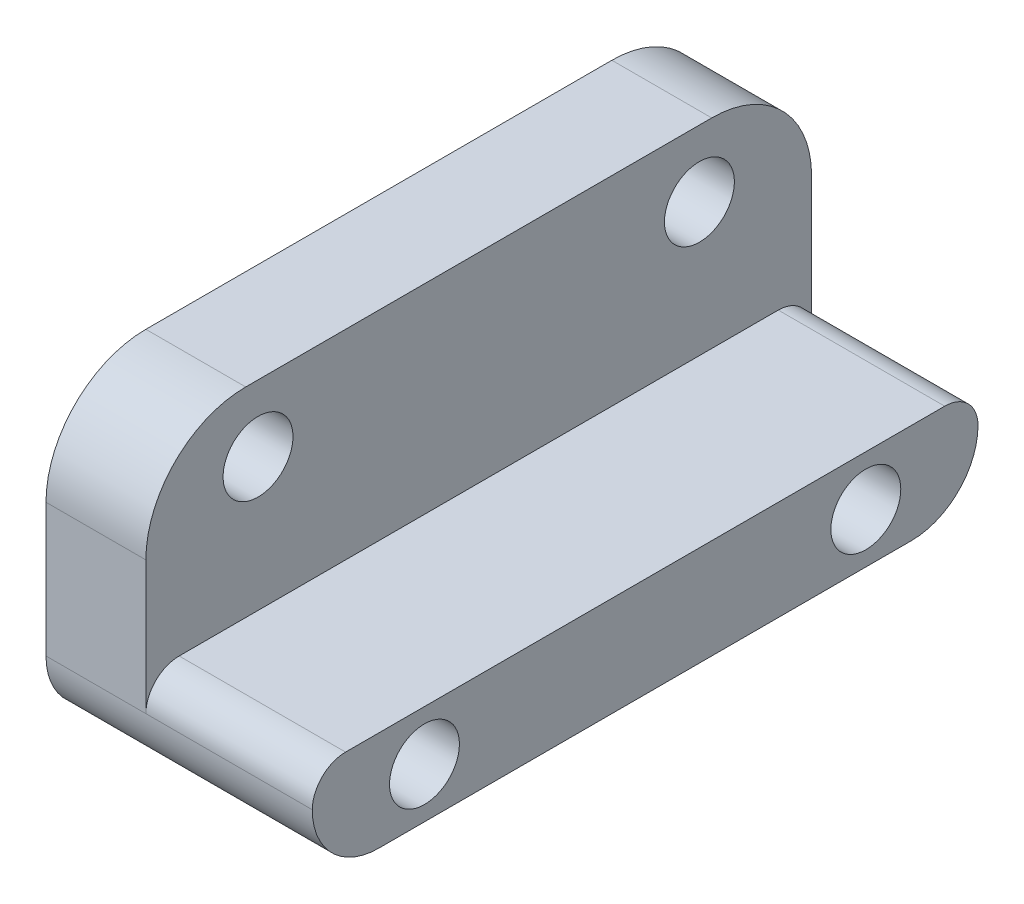
ISO-10303-21;
HEADER;
FILE_DESCRIPTION(('STEP AP214'),'2;1');
FILE_NAME('part.step','',(''),(''),'','','');
FILE_SCHEMA(('AUTOMOTIVE_DESIGN { 1 0 10303 214 1 1 1 1 }'));
ENDSEC;
DATA;
#1=APPLICATION_CONTEXT('core data for automotive mechanical design processes');
#2=APPLICATION_PROTOCOL_DEFINITION('international standard','automotive_design',2000,#1);
#3=PRODUCT_CONTEXT('',#1,'mechanical');
#4=PRODUCT('Part','Part','',(#3));
#5=PRODUCT_RELATED_PRODUCT_CATEGORY('part','',(#4));
#6=PRODUCT_DEFINITION_FORMATION('','',#4);
#7=PRODUCT_DEFINITION_CONTEXT('part definition',#1,'design');
#8=PRODUCT_DEFINITION('design','',#6,#7);
#9=PRODUCT_DEFINITION_SHAPE('','',#8);
#10=(LENGTH_UNIT() NAMED_UNIT(*) SI_UNIT(.MILLI.,.METRE.));
#11=(NAMED_UNIT(*) PLANE_ANGLE_UNIT() SI_UNIT($,.RADIAN.));
#12=(NAMED_UNIT(*) SI_UNIT($,.STERADIAN.) SOLID_ANGLE_UNIT());
#13=UNCERTAINTY_MEASURE_WITH_UNIT(LENGTH_MEASURE(1.E-05),#10,'distance_accuracy_value','');
#14=(GEOMETRIC_REPRESENTATION_CONTEXT(3) GLOBAL_UNCERTAINTY_ASSIGNED_CONTEXT((#13)) GLOBAL_UNIT_ASSIGNED_CONTEXT((#10,
#11,#12)) REPRESENTATION_CONTEXT('',''));
#15=CARTESIAN_POINT('',(0.,0.,0.));
#16=DIRECTION('',(0.,0.,1.));
#17=DIRECTION('',(1.,0.,0.));
#18=AXIS2_PLACEMENT_3D('',#15,#16,#17);
#19=CARTESIAN_POINT('',(8.,-7.,-19.));
#20=DIRECTION('',(-1.,0.,0.));
#21=DIRECTION('',(0.,0.,1.));
#22=AXIS2_PLACEMENT_3D('',#19,#20,#21);
#23=CYLINDRICAL_SURFACE('',#22,1.);
#24=DIRECTION('',(-1.,0.,0.));
#25=VECTOR('',#24,1.);
#26=CARTESIAN_POINT('',(8.,-6.,-19.));
#27=LINE('',#26,#25);
#28=CARTESIAN_POINT('',(8.,-6.,-19.));
#29=VERTEX_POINT('',#28);
#30=CARTESIAN_POINT('',(3.,-6.,-19.));
#31=VERTEX_POINT('',#30);
#32=EDGE_CURVE('E196',#29,#31,#27,.T.);
#33=ORIENTED_EDGE('',*,*,#32,.F.);
#34=CARTESIAN_POINT('',(8.,-7.,-19.));
#35=DIRECTION('',(-1.,0.,0.));
#36=DIRECTION('',(0.,0.,1.));
#37=AXIS2_PLACEMENT_3D('',#34,#35,#36);
#38=CIRCLE('',#37,1.);
#39=CARTESIAN_POINT('',(8.,-7.,-20.));
#40=VERTEX_POINT('',#39);
#41=EDGE_CURVE('E48',#40,#29,#38,.F.);
#42=ORIENTED_EDGE('',*,*,#41,.F.);
#43=DIRECTION('',(-1.,0.,0.));
#44=VECTOR('',#43,1.);
#45=CARTESIAN_POINT('',(3.,-7.,-20.));
#46=LINE('',#45,#44);
#47=CARTESIAN_POINT('',(3.,-7.,-20.));
#48=VERTEX_POINT('',#47);
#49=EDGE_CURVE('E166',#40,#48,#46,.T.);
#50=ORIENTED_EDGE('',*,*,#49,.T.);
#51=CARTESIAN_POINT('',(3.,-7.,-19.));
#52=DIRECTION('',(1.,0.,0.));
#53=DIRECTION('',(0.,0.,-1.));
#54=AXIS2_PLACEMENT_3D('',#51,#52,#53);
#55=CIRCLE('',#54,1.);
#56=EDGE_CURVE('E11',#48,#31,#55,.T.);
#57=ORIENTED_EDGE('',*,*,#56,.T.);
#58=EDGE_LOOP('',(#33,#42,#50,#57));
#59=FACE_BOUND('',#58,.T.);
#60=ADVANCED_FACE('F41',(#59),#23,.T.);
#61=CARTESIAN_POINT('',(8.,-7.,-1.));
#62=DIRECTION('',(1.,0.,0.));
#63=DIRECTION('',(0.,0.,-1.));
#64=AXIS2_PLACEMENT_3D('',#61,#62,#63);
#65=CYLINDRICAL_SURFACE('',#64,1.);
#66=DIRECTION('',(1.,0.,0.));
#67=VECTOR('',#66,1.);
#68=CARTESIAN_POINT('',(8.,-6.,-1.));
#69=LINE('',#68,#67);
#70=CARTESIAN_POINT('',(3.,-6.,-1.));
#71=VERTEX_POINT('',#70);
#72=CARTESIAN_POINT('',(8.,-6.,-1.));
#73=VERTEX_POINT('',#72);
#74=EDGE_CURVE('E188',#71,#73,#69,.T.);
#75=ORIENTED_EDGE('',*,*,#74,.F.);
#76=CARTESIAN_POINT('',(3.,-7.,-1.));
#77=DIRECTION('',(1.,0.,0.));
#78=DIRECTION('',(0.,0.,-1.));
#79=AXIS2_PLACEMENT_3D('',#76,#77,#78);
#80=CIRCLE('',#79,1.);
#81=CARTESIAN_POINT('',(3.,-7.,0.));
#82=VERTEX_POINT('',#81);
#83=EDGE_CURVE('E193',#71,#82,#80,.T.);
#84=ORIENTED_EDGE('',*,*,#83,.T.);
#85=DIRECTION('',(1.,0.,0.));
#86=VECTOR('',#85,1.);
#87=CARTESIAN_POINT('',(3.,-7.,0.));
#88=LINE('',#87,#86);
#89=CARTESIAN_POINT('',(8.,-7.,0.));
#90=VERTEX_POINT('',#89);
#91=EDGE_CURVE('E177',#82,#90,#88,.T.);
#92=ORIENTED_EDGE('',*,*,#91,.T.);
#93=CARTESIAN_POINT('',(8.,-7.,-1.));
#94=DIRECTION('',(-1.,0.,0.));
#95=DIRECTION('',(0.,0.,1.));
#96=AXIS2_PLACEMENT_3D('',#93,#94,#95);
#97=CIRCLE('',#96,1.);
#98=EDGE_CURVE('E191',#73,#90,#97,.F.);
#99=ORIENTED_EDGE('',*,*,#98,.F.);
#100=EDGE_LOOP('',(#75,#84,#92,#99));
#101=FACE_BOUND('',#100,.T.);
#102=ADVANCED_FACE('F254',(#101),#65,.T.);
#103=CARTESIAN_POINT('',(3.,-7.,-2.));
#104=DIRECTION('',(1.,0.,0.));
#105=DIRECTION('',(0.,0.,-1.));
#106=AXIS2_PLACEMENT_3D('',#103,#104,#105);
#107=CYLINDRICAL_SURFACE('',#106,2.);
#108=CARTESIAN_POINT('',(0.,-7.,0.));
#109=VERTEX_POINT('',#108);
#110=EDGE_CURVE('E178',#109,#82,#88,.T.);
#111=ORIENTED_EDGE('',*,*,#110,.F.);
#112=CARTESIAN_POINT('',(0.,-7.,-2.));
#113=DIRECTION('',(1.,0.,0.));
#114=DIRECTION('',(0.,0.,-1.));
#115=AXIS2_PLACEMENT_3D('',#112,#113,#114);
#116=CIRCLE('',#115,2.);
#117=CARTESIAN_POINT('',(0.,-9.,-2.));
#118=VERTEX_POINT('',#117);
#119=EDGE_CURVE('E184',#118,#109,#116,.F.);
#120=ORIENTED_EDGE('',*,*,#119,.F.);
#121=DIRECTION('',(1.,0.,0.));
#122=VECTOR('',#121,1.);
#123=CARTESIAN_POINT('',(3.,-9.,-2.));
#124=LINE('',#123,#122);
#125=CARTESIAN_POINT('',(8.,-9.,-2.));
#126=VERTEX_POINT('',#125);
#127=EDGE_CURVE('E181',#126,#118,#124,.F.);
#128=ORIENTED_EDGE('',*,*,#127,.F.);
#129=CARTESIAN_POINT('',(8.,-7.,-2.));
#130=DIRECTION('',(-1.,0.,0.));
#131=DIRECTION('',(0.,0.,1.));
#132=AXIS2_PLACEMENT_3D('',#129,#130,#131);
#133=CIRCLE('',#132,2.);
#134=EDGE_CURVE('E186',#90,#126,#133,.F.);
#135=ORIENTED_EDGE('',*,*,#134,.F.);
#136=ORIENTED_EDGE('',*,*,#91,.F.);
#137=EDGE_LOOP('',(#111,#120,#128,#135,#136));
#138=FACE_BOUND('',#137,.T.);
#139=ADVANCED_FACE('F248',(#138),#107,.T.);
#140=CARTESIAN_POINT('',(3.,-7.,-18.));
#141=DIRECTION('',(-1.,0.,0.));
#142=DIRECTION('',(0.,0.,1.));
#143=AXIS2_PLACEMENT_3D('',#140,#141,#142);
#144=CYLINDRICAL_SURFACE('',#143,2.);
#145=ORIENTED_EDGE('',*,*,#49,.F.);
#146=CARTESIAN_POINT('',(8.,-7.,-18.));
#147=DIRECTION('',(-1.,0.,0.));
#148=DIRECTION('',(0.,0.,1.));
#149=AXIS2_PLACEMENT_3D('',#146,#147,#148);
#150=CIRCLE('',#149,2.);
#151=CARTESIAN_POINT('',(8.,-9.,-18.));
#152=VERTEX_POINT('',#151);
#153=EDGE_CURVE('E172',#152,#40,#150,.F.);
#154=ORIENTED_EDGE('',*,*,#153,.F.);
#155=DIRECTION('',(-1.,0.,0.));
#156=VECTOR('',#155,1.);
#157=CARTESIAN_POINT('',(3.,-9.,-18.));
#158=LINE('',#157,#156);
#159=CARTESIAN_POINT('',(0.,-9.,-18.));
#160=VERTEX_POINT('',#159);
#161=EDGE_CURVE('E169',#160,#152,#158,.F.);
#162=ORIENTED_EDGE('',*,*,#161,.F.);
#163=CARTESIAN_POINT('',(0.,-7.,-18.));
#164=DIRECTION('',(1.,0.,0.));
#165=DIRECTION('',(0.,0.,-1.));
#166=AXIS2_PLACEMENT_3D('',#163,#164,#165);
#167=CIRCLE('',#166,2.);
#168=CARTESIAN_POINT('',(0.,-7.,-20.));
#169=VERTEX_POINT('',#168);
#170=EDGE_CURVE('E174',#169,#160,#167,.F.);
#171=ORIENTED_EDGE('',*,*,#170,.F.);
#172=EDGE_CURVE('E165',#48,#169,#46,.T.);
#173=ORIENTED_EDGE('',*,*,#172,.F.);
#174=EDGE_LOOP('',(#145,#154,#162,#171,#173));
#175=FACE_BOUND('',#174,.T.);
#176=ADVANCED_FACE('F263',(#175),#144,.T.);
#177=CARTESIAN_POINT('',(3.,-3.,-17.));
#178=DIRECTION('',(-1.,0.,0.));
#179=DIRECTION('',(0.,0.,1.));
#180=AXIS2_PLACEMENT_3D('',#177,#178,#179);
#181=CYLINDRICAL_SURFACE('',#180,3.);
#182=DIRECTION('',(-1.,0.,0.));
#183=VECTOR('',#182,1.);
#184=CARTESIAN_POINT('',(3.,0.,-17.));
#185=LINE('',#184,#183);
#186=CARTESIAN_POINT('',(3.,0.,-17.));
#187=VERTEX_POINT('',#186);
#188=CARTESIAN_POINT('',(0.,0.,-17.));
#189=VERTEX_POINT('',#188);
#190=EDGE_CURVE('E130',#187,#189,#185,.T.);
#191=ORIENTED_EDGE('',*,*,#190,.F.);
#192=CARTESIAN_POINT('',(3.,-3.,-17.));
#193=DIRECTION('',(1.,0.,0.));
#194=DIRECTION('',(0.,0.,-1.));
#195=AXIS2_PLACEMENT_3D('',#192,#193,#194);
#196=CIRCLE('',#195,3.);
#197=CARTESIAN_POINT('',(3.,-3.,-20.));
#198=VERTEX_POINT('',#197);
#199=EDGE_CURVE('E161',#198,#187,#196,.T.);
#200=ORIENTED_EDGE('',*,*,#199,.F.);
#201=DIRECTION('',(-1.,0.,0.));
#202=VECTOR('',#201,1.);
#203=CARTESIAN_POINT('',(3.,-3.,-20.));
#204=LINE('',#203,#202);
#205=CARTESIAN_POINT('',(0.,-3.,-20.));
#206=VERTEX_POINT('',#205);
#207=EDGE_CURVE('E159',#206,#198,#204,.F.);
#208=ORIENTED_EDGE('',*,*,#207,.F.);
#209=CARTESIAN_POINT('',(0.,-3.,-17.));
#210=DIRECTION('',(1.,0.,0.));
#211=DIRECTION('',(0.,0.,-1.));
#212=AXIS2_PLACEMENT_3D('',#209,#210,#211);
#213=CIRCLE('',#212,3.);
#214=EDGE_CURVE('E163',#189,#206,#213,.F.);
#215=ORIENTED_EDGE('',*,*,#214,.F.);
#216=EDGE_LOOP('',(#191,#200,#208,#215));
#217=FACE_BOUND('',#216,.T.);
#218=ADVANCED_FACE('F241',(#217),#181,.T.);
#219=CARTESIAN_POINT('',(3.,-3.,-3.));
#220=DIRECTION('',(1.,0.,0.));
#221=DIRECTION('',(0.,0.,-1.));
#222=AXIS2_PLACEMENT_3D('',#219,#220,#221);
#223=CYLINDRICAL_SURFACE('',#222,3.);
#224=DIRECTION('',(1.,0.,0.));
#225=VECTOR('',#224,1.);
#226=CARTESIAN_POINT('',(3.,0.,-3.));
#227=LINE('',#226,#225);
#228=CARTESIAN_POINT('',(0.,0.,-3.));
#229=VERTEX_POINT('',#228);
#230=CARTESIAN_POINT('',(3.,0.,-3.));
#231=VERTEX_POINT('',#230);
#232=EDGE_CURVE('E128',#229,#231,#227,.T.);
#233=ORIENTED_EDGE('',*,*,#232,.F.);
#234=CARTESIAN_POINT('',(0.,-3.,-3.));
#235=DIRECTION('',(1.,0.,0.));
#236=DIRECTION('',(0.,0.,-1.));
#237=AXIS2_PLACEMENT_3D('',#234,#235,#236);
#238=CIRCLE('',#237,3.);
#239=CARTESIAN_POINT('',(0.,-3.,0.));
#240=VERTEX_POINT('',#239);
#241=EDGE_CURVE('E137',#240,#229,#238,.F.);
#242=ORIENTED_EDGE('',*,*,#241,.F.);
#243=DIRECTION('',(1.,0.,0.));
#244=VECTOR('',#243,1.);
#245=CARTESIAN_POINT('',(3.,-3.,0.));
#246=LINE('',#245,#244);
#247=CARTESIAN_POINT('',(3.,-3.,0.));
#248=VERTEX_POINT('',#247);
#249=EDGE_CURVE('E147',#248,#240,#246,.F.);
#250=ORIENTED_EDGE('',*,*,#249,.F.);
#251=CARTESIAN_POINT('',(3.,-3.,-3.));
#252=DIRECTION('',(1.,0.,0.));
#253=DIRECTION('',(0.,0.,-1.));
#254=AXIS2_PLACEMENT_3D('',#251,#252,#253);
#255=CIRCLE('',#254,3.);
#256=EDGE_CURVE('E146',#231,#248,#255,.T.);
#257=ORIENTED_EDGE('',*,*,#256,.F.);
#258=EDGE_LOOP('',(#233,#242,#250,#257));
#259=FACE_BOUND('',#258,.T.);
#260=ADVANCED_FACE('F150',(#259),#223,.T.);
#261=CARTESIAN_POINT('',(3.,0.,0.));
#262=DIRECTION('',(1.,0.,0.));
#263=DIRECTION('',(0.,0.,-1.));
#264=AXIS2_PLACEMENT_3D('',#261,#262,#263);
#265=PLANE('',#264);
#266=DIRECTION('',(0.,1.,0.));
#267=VECTOR('',#266,1.);
#268=CARTESIAN_POINT('',(3.,0.,-20.));
#269=LINE('',#268,#267);
#270=EDGE_CURVE('E55',#48,#198,#269,.T.);
#271=ORIENTED_EDGE('',*,*,#270,.T.);
#272=ORIENTED_EDGE('',*,*,#199,.T.);
#273=DIRECTION('',(0.,0.,1.));
#274=VECTOR('',#273,1.);
#275=CARTESIAN_POINT('',(3.,0.,0.));
#276=LINE('',#275,#274);
#277=EDGE_CURVE('E151',#187,#231,#276,.T.);
#278=ORIENTED_EDGE('',*,*,#277,.T.);
#279=ORIENTED_EDGE('',*,*,#256,.T.);
#280=DIRECTION('',(0.,-1.,0.));
#281=VECTOR('',#280,1.);
#282=CARTESIAN_POINT('',(3.,0.,0.));
#283=LINE('',#282,#281);
#284=EDGE_CURVE('E133',#248,#82,#283,.T.);
#285=ORIENTED_EDGE('',*,*,#284,.T.);
#286=ORIENTED_EDGE('',*,*,#83,.F.);
#287=DIRECTION('',(0.,0.,1.));
#288=VECTOR('',#287,1.);
#289=CARTESIAN_POINT('',(3.,-6.,0.));
#290=LINE('',#289,#288);
#291=EDGE_CURVE('E202',#31,#71,#290,.T.);
#292=ORIENTED_EDGE('',*,*,#291,.F.);
#293=ORIENTED_EDGE('',*,*,#56,.F.);
#294=EDGE_LOOP('',(#271,#272,#278,#279,#285,#286,#292,#293));
#295=FACE_BOUND('',#294,.T.);
#296=CARTESIAN_POINT('',(3.,-2.,-3.37));
#297=DIRECTION('',(1.,0.,0.));
#298=DIRECTION('',(0.,0.,-1.));
#299=AXIS2_PLACEMENT_3D('',#296,#297,#298);
#300=CIRCLE('',#299,1.05);
#301=CARTESIAN_POINT('',(3.,-2.,-4.42));
#302=VERTEX_POINT('',#301);
#303=EDGE_CURVE('E227',#302,#302,#300,.T.);
#304=ORIENTED_EDGE('',*,*,#303,.F.);
#305=EDGE_LOOP('',(#304));
#306=FACE_BOUND('',#305,.T.);
#307=CARTESIAN_POINT('',(3.,-2.,-16.63));
#308=DIRECTION('',(1.,0.,0.));
#309=DIRECTION('',(0.,0.,1.));
#310=AXIS2_PLACEMENT_3D('',#307,#308,#309);
#311=CIRCLE('',#310,1.05);
#312=CARTESIAN_POINT('',(3.,-2.,-15.58));
#313=VERTEX_POINT('',#312);
#314=EDGE_CURVE('E220',#313,#313,#311,.T.);
#315=ORIENTED_EDGE('',*,*,#314,.F.);
#316=EDGE_LOOP('',(#315));
#317=FACE_BOUND('',#316,.T.);
#318=ADVANCED_FACE('F207',(#295,#306,#317),#265,.T.);
#319=CARTESIAN_POINT('',(0.,0.,0.));
#320=DIRECTION('',(1.,0.,0.));
#321=DIRECTION('',(0.,0.,-1.));
#322=AXIS2_PLACEMENT_3D('',#319,#320,#321);
#323=PLANE('',#322);
#324=CARTESIAN_POINT('',(0.,-7.5,-3.37));
#325=DIRECTION('',(1.,0.,0.));
#326=DIRECTION('',(0.,0.,-1.));
#327=AXIS2_PLACEMENT_3D('',#324,#325,#326);
#328=CIRCLE('',#327,1.05);
#329=CARTESIAN_POINT('',(0.,-7.5,-4.42));
#330=VERTEX_POINT('',#329);
#331=EDGE_CURVE('E212',#330,#330,#328,.T.);
#332=ORIENTED_EDGE('',*,*,#331,.T.);
#333=EDGE_LOOP('',(#332));
#334=FACE_BOUND('',#333,.T.);
#335=CARTESIAN_POINT('',(0.,-7.5,-16.63));
#336=DIRECTION('',(1.,0.,0.));
#337=DIRECTION('',(0.,0.,-1.));
#338=AXIS2_PLACEMENT_3D('',#335,#336,#337);
#339=CIRCLE('',#338,1.05);
#340=CARTESIAN_POINT('',(0.,-7.5,-17.68));
#341=VERTEX_POINT('',#340);
#342=EDGE_CURVE('E216',#341,#341,#339,.T.);
#343=ORIENTED_EDGE('',*,*,#342,.T.);
#344=EDGE_LOOP('',(#343));
#345=FACE_BOUND('',#344,.T.);
#346=DIRECTION('',(0.,0.,-1.));
#347=VECTOR('',#346,1.);
#348=CARTESIAN_POINT('',(0.,-9.,0.));
#349=LINE('',#348,#347);
#350=EDGE_CURVE('E235',#118,#160,#349,.T.);
#351=ORIENTED_EDGE('',*,*,#350,.F.);
#352=ORIENTED_EDGE('',*,*,#119,.T.);
#353=DIRECTION('',(0.,-1.,0.));
#354=VECTOR('',#353,1.);
#355=CARTESIAN_POINT('',(0.,0.,0.));
#356=LINE('',#355,#354);
#357=EDGE_CURVE('E142',#240,#109,#356,.T.);
#358=ORIENTED_EDGE('',*,*,#357,.F.);
#359=ORIENTED_EDGE('',*,*,#241,.T.);
#360=DIRECTION('',(0.,0.,1.));
#361=VECTOR('',#360,1.);
#362=CARTESIAN_POINT('',(0.,0.,0.));
#363=LINE('',#362,#361);
#364=EDGE_CURVE('E123',#189,#229,#363,.T.);
#365=ORIENTED_EDGE('',*,*,#364,.F.);
#366=ORIENTED_EDGE('',*,*,#214,.T.);
#367=DIRECTION('',(0.,1.,0.));
#368=VECTOR('',#367,1.);
#369=CARTESIAN_POINT('',(0.,0.,-20.));
#370=LINE('',#369,#368);
#371=EDGE_CURVE('E134',#169,#206,#370,.T.);
#372=ORIENTED_EDGE('',*,*,#371,.F.);
#373=ORIENTED_EDGE('',*,*,#170,.T.);
#374=EDGE_LOOP('',(#351,#352,#358,#359,#365,#366,#372,#373));
#375=FACE_BOUND('',#374,.T.);
#376=CARTESIAN_POINT('',(0.,-2.,-3.37));
#377=DIRECTION('',(1.,0.,0.));
#378=DIRECTION('',(0.,0.,-1.));
#379=AXIS2_PLACEMENT_3D('',#376,#377,#378);
#380=CIRCLE('',#379,1.05);
#381=CARTESIAN_POINT('',(0.,-2.,-4.42));
#382=VERTEX_POINT('',#381);
#383=EDGE_CURVE('E223',#382,#382,#380,.T.);
#384=ORIENTED_EDGE('',*,*,#383,.T.);
#385=EDGE_LOOP('',(#384));
#386=FACE_BOUND('',#385,.T.);
#387=CARTESIAN_POINT('',(0.,-2.,-16.63));
#388=DIRECTION('',(1.,0.,0.));
#389=DIRECTION('',(0.,0.,1.));
#390=AXIS2_PLACEMENT_3D('',#387,#388,#389);
#391=CIRCLE('',#390,1.05);
#392=CARTESIAN_POINT('',(0.,-2.,-15.58));
#393=VERTEX_POINT('',#392);
#394=EDGE_CURVE('E224',#393,#393,#391,.T.);
#395=ORIENTED_EDGE('',*,*,#394,.T.);
#396=EDGE_LOOP('',(#395));
#397=FACE_BOUND('',#396,.T.);
#398=ADVANCED_FACE('F139',(#334,#345,#375,#386,#397),#323,.F.);
#399=CARTESIAN_POINT('',(3.,0.,0.));
#400=DIRECTION('',(0.,0.,-1.));
#401=DIRECTION('',(0.,1.,0.));
#402=AXIS2_PLACEMENT_3D('',#399,#400,#401);
#403=PLANE('',#402);
#404=ORIENTED_EDGE('',*,*,#110,.T.);
#405=ORIENTED_EDGE('',*,*,#284,.F.);
#406=ORIENTED_EDGE('',*,*,#249,.T.);
#407=ORIENTED_EDGE('',*,*,#357,.T.);
#408=EDGE_LOOP('',(#404,#405,#406,#407));
#409=FACE_BOUND('',#408,.T.);
#410=ADVANCED_FACE('F244',(#409),#403,.F.);
#411=CARTESIAN_POINT('',(3.,-9.,0.));
#412=DIRECTION('',(0.,1.,0.));
#413=DIRECTION('',(0.,0.,1.));
#414=AXIS2_PLACEMENT_3D('',#411,#412,#413);
#415=PLANE('',#414);
#416=DIRECTION('',(0.,0.,-1.));
#417=VECTOR('',#416,1.);
#418=CARTESIAN_POINT('',(8.,-9.,0.));
#419=LINE('',#418,#417);
#420=EDGE_CURVE('E211',#126,#152,#419,.T.);
#421=ORIENTED_EDGE('',*,*,#420,.F.);
#422=ORIENTED_EDGE('',*,*,#127,.T.);
#423=ORIENTED_EDGE('',*,*,#350,.T.);
#424=ORIENTED_EDGE('',*,*,#161,.T.);
#425=EDGE_LOOP('',(#421,#422,#423,#424));
#426=FACE_BOUND('',#425,.T.);
#427=ADVANCED_FACE('F259',(#426),#415,.F.);
#428=CARTESIAN_POINT('',(3.,0.,-20.));
#429=DIRECTION('',(0.,0.,1.));
#430=DIRECTION('',(0.,-1.,0.));
#431=AXIS2_PLACEMENT_3D('',#428,#429,#430);
#432=PLANE('',#431);
#433=ORIENTED_EDGE('',*,*,#270,.F.);
#434=ORIENTED_EDGE('',*,*,#172,.T.);
#435=ORIENTED_EDGE('',*,*,#371,.T.);
#436=ORIENTED_EDGE('',*,*,#207,.T.);
#437=EDGE_LOOP('',(#433,#434,#435,#436));
#438=FACE_BOUND('',#437,.T.);
#439=ADVANCED_FACE('F237',(#438),#432,.F.);
#440=CARTESIAN_POINT('',(3.,0.,0.));
#441=DIRECTION('',(0.,-1.,0.));
#442=DIRECTION('',(0.,0.,-1.));
#443=AXIS2_PLACEMENT_3D('',#440,#441,#442);
#444=PLANE('',#443);
#445=ORIENTED_EDGE('',*,*,#277,.F.);
#446=ORIENTED_EDGE('',*,*,#190,.T.);
#447=ORIENTED_EDGE('',*,*,#364,.T.);
#448=ORIENTED_EDGE('',*,*,#232,.T.);
#449=EDGE_LOOP('',(#445,#446,#447,#448));
#450=FACE_BOUND('',#449,.T.);
#451=ADVANCED_FACE('F126',(#450),#444,.F.);
#452=CARTESIAN_POINT('',(3.,-2.,-3.37));
#453=DIRECTION('',(-1.,0.,0.));
#454=DIRECTION('',(0.,0.,1.));
#455=AXIS2_PLACEMENT_3D('',#452,#453,#454);
#456=CYLINDRICAL_SURFACE('',#455,1.05);
#457=ORIENTED_EDGE('',*,*,#303,.T.);
#458=EDGE_LOOP('',(#457));
#459=FACE_BOUND('',#458,.T.);
#460=ORIENTED_EDGE('',*,*,#383,.F.);
#461=EDGE_LOOP('',(#460));
#462=FACE_BOUND('',#461,.T.);
#463=ADVANCED_FACE('F287',(#459,#462),#456,.F.);
#464=CARTESIAN_POINT('',(3.,-2.,-16.63));
#465=DIRECTION('',(-1.,0.,0.));
#466=DIRECTION('',(0.,0.,1.));
#467=AXIS2_PLACEMENT_3D('',#464,#465,#466);
#468=CYLINDRICAL_SURFACE('',#467,1.05);
#469=ORIENTED_EDGE('',*,*,#314,.T.);
#470=EDGE_LOOP('',(#469));
#471=FACE_BOUND('',#470,.T.);
#472=ORIENTED_EDGE('',*,*,#394,.F.);
#473=EDGE_LOOP('',(#472));
#474=FACE_BOUND('',#473,.T.);
#475=ADVANCED_FACE('F295',(#471,#474),#468,.F.);
#476=CARTESIAN_POINT('',(8.,-6.,0.));
#477=DIRECTION('',(0.,-1.,0.));
#478=DIRECTION('',(0.,0.,-1.));
#479=AXIS2_PLACEMENT_3D('',#476,#477,#478);
#480=PLANE('',#479);
#481=DIRECTION('',(0.,0.,1.));
#482=VECTOR('',#481,1.);
#483=CARTESIAN_POINT('',(8.,-6.,0.));
#484=LINE('',#483,#482);
#485=EDGE_CURVE('E204',#29,#73,#484,.T.);
#486=ORIENTED_EDGE('',*,*,#485,.F.);
#487=ORIENTED_EDGE('',*,*,#32,.T.);
#488=ORIENTED_EDGE('',*,*,#291,.T.);
#489=ORIENTED_EDGE('',*,*,#74,.T.);
#490=EDGE_LOOP('',(#486,#487,#488,#489));
#491=FACE_BOUND('',#490,.T.);
#492=ADVANCED_FACE('F201',(#491),#480,.F.);
#493=CARTESIAN_POINT('',(8.,0.,0.));
#494=DIRECTION('',(-1.,0.,0.));
#495=DIRECTION('',(0.,0.,1.));
#496=AXIS2_PLACEMENT_3D('',#493,#494,#495);
#497=PLANE('',#496);
#498=CARTESIAN_POINT('',(8.,-7.5,-3.37));
#499=DIRECTION('',(1.,0.,0.));
#500=DIRECTION('',(0.,0.,-1.));
#501=AXIS2_PLACEMENT_3D('',#498,#499,#500);
#502=CIRCLE('',#501,1.05);
#503=CARTESIAN_POINT('',(8.,-7.5,-4.42));
#504=VERTEX_POINT('',#503);
#505=EDGE_CURVE('E317',#504,#504,#502,.T.);
#506=ORIENTED_EDGE('',*,*,#505,.F.);
#507=EDGE_LOOP('',(#506));
#508=FACE_BOUND('',#507,.T.);
#509=CARTESIAN_POINT('',(8.,-7.5,-16.63));
#510=DIRECTION('',(1.,0.,0.));
#511=DIRECTION('',(0.,0.,1.));
#512=AXIS2_PLACEMENT_3D('',#509,#510,#511);
#513=CIRCLE('',#512,1.05);
#514=CARTESIAN_POINT('',(8.,-7.5,-15.58));
#515=VERTEX_POINT('',#514);
#516=EDGE_CURVE('E324',#515,#515,#513,.T.);
#517=ORIENTED_EDGE('',*,*,#516,.F.);
#518=EDGE_LOOP('',(#517));
#519=FACE_BOUND('',#518,.T.);
#520=ORIENTED_EDGE('',*,*,#153,.T.);
#521=ORIENTED_EDGE('',*,*,#41,.T.);
#522=ORIENTED_EDGE('',*,*,#485,.T.);
#523=ORIENTED_EDGE('',*,*,#98,.T.);
#524=ORIENTED_EDGE('',*,*,#134,.T.);
#525=ORIENTED_EDGE('',*,*,#420,.T.);
#526=EDGE_LOOP('',(#520,#521,#522,#523,#524,#525));
#527=FACE_BOUND('',#526,.T.);
#528=ADVANCED_FACE('F255',(#508,#519,#527),#497,.F.);
#529=CARTESIAN_POINT('',(-2.,-7.5,-16.63));
#530=DIRECTION('',(1.,0.,0.));
#531=DIRECTION('',(0.,0.,-1.));
#532=AXIS2_PLACEMENT_3D('',#529,#530,#531);
#533=CYLINDRICAL_SURFACE('',#532,1.05);
#534=ORIENTED_EDGE('',*,*,#516,.T.);
#535=EDGE_LOOP('',(#534));
#536=FACE_BOUND('',#535,.T.);
#537=ORIENTED_EDGE('',*,*,#342,.F.);
#538=EDGE_LOOP('',(#537));
#539=FACE_BOUND('',#538,.T.);
#540=ADVANCED_FACE('F304',(#536,#539),#533,.F.);
#541=CARTESIAN_POINT('',(-2.,-7.5,-3.37));
#542=DIRECTION('',(1.,0.,0.));
#543=DIRECTION('',(0.,0.,-1.));
#544=AXIS2_PLACEMENT_3D('',#541,#542,#543);
#545=CYLINDRICAL_SURFACE('',#544,1.05);
#546=ORIENTED_EDGE('',*,*,#505,.T.);
#547=EDGE_LOOP('',(#546));
#548=FACE_BOUND('',#547,.T.);
#549=ORIENTED_EDGE('',*,*,#331,.F.);
#550=EDGE_LOOP('',(#549));
#551=FACE_BOUND('',#550,.T.);
#552=ADVANCED_FACE('F308',(#548,#551),#545,.F.);
#553=CLOSED_SHELL('',(#60,#102,#139,#176,#218,#260,#318,#398,#410,#427,#439,#451,#463,#475,#492,
#528,#540,#552));
#554=MANIFOLD_SOLID_BREP('B2',#553);
#555=ADVANCED_BREP_SHAPE_REPRESENTATION('',(#18,#554),#14);
#556=SHAPE_DEFINITION_REPRESENTATION(#9,#555);
ENDSEC;
END-ISO-10303-21;
